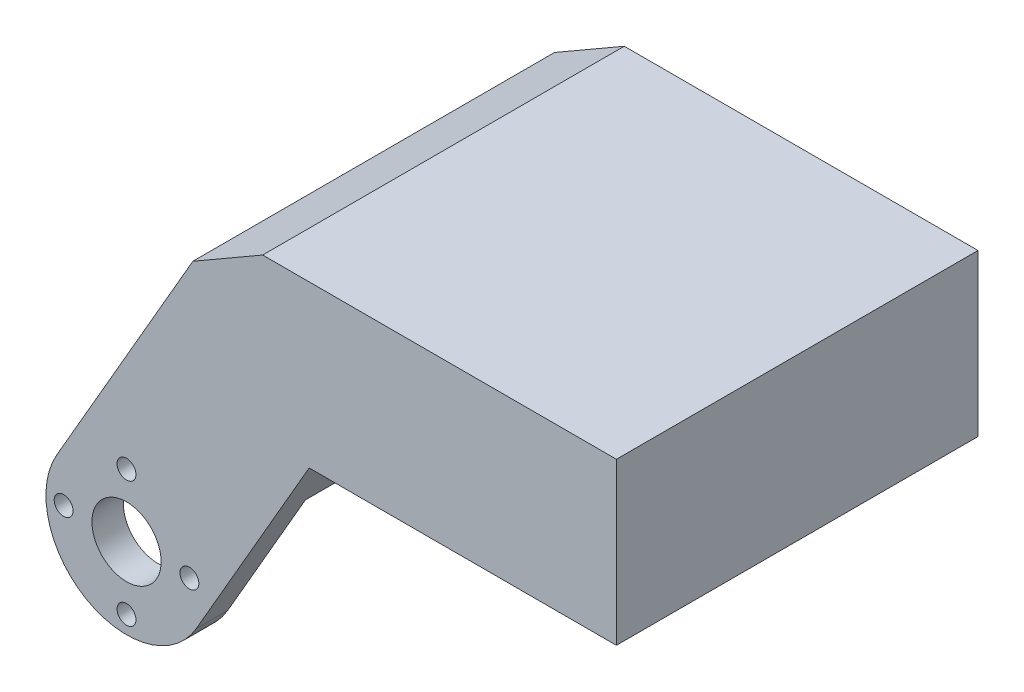
ISO-10303-21;
HEADER;
FILE_DESCRIPTION(('STEP AP214'),'2;1');
FILE_NAME('part.step','',(''),(''),'','','');
FILE_SCHEMA(('AUTOMOTIVE_DESIGN { 1 0 10303 214 1 1 1 1 }'));
ENDSEC;
DATA;
#1=APPLICATION_CONTEXT('core data for automotive mechanical design processes');
#2=APPLICATION_PROTOCOL_DEFINITION('international standard','automotive_design',2000,#1);
#3=PRODUCT_CONTEXT('',#1,'mechanical');
#4=PRODUCT('Part','Part','',(#3));
#5=PRODUCT_RELATED_PRODUCT_CATEGORY('part','',(#4));
#6=PRODUCT_DEFINITION_FORMATION('','',#4);
#7=PRODUCT_DEFINITION_CONTEXT('part definition',#1,'design');
#8=PRODUCT_DEFINITION('design','',#6,#7);
#9=PRODUCT_DEFINITION_SHAPE('','',#8);
#10=(LENGTH_UNIT() NAMED_UNIT(*) SI_UNIT(.MILLI.,.METRE.));
#11=(NAMED_UNIT(*) PLANE_ANGLE_UNIT() SI_UNIT($,.RADIAN.));
#12=(NAMED_UNIT(*) SI_UNIT($,.STERADIAN.) SOLID_ANGLE_UNIT());
#13=UNCERTAINTY_MEASURE_WITH_UNIT(LENGTH_MEASURE(1.E-05),#10,'distance_accuracy_value','');
#14=(GEOMETRIC_REPRESENTATION_CONTEXT(3) GLOBAL_UNCERTAINTY_ASSIGNED_CONTEXT((#13)) GLOBAL_UNIT_ASSIGNED_CONTEXT((#10,
#11,#12)) REPRESENTATION_CONTEXT('',''));
#15=CARTESIAN_POINT('',(0.,0.,0.));
#16=DIRECTION('',(0.,0.,1.));
#17=DIRECTION('',(1.,0.,0.));
#18=AXIS2_PLACEMENT_3D('',#15,#16,#17);
#19=CARTESIAN_POINT('',(0.,-8.,-46.));
#20=DIRECTION('',(0.,0.,1.));
#21=DIRECTION('',(1.,0.,0.));
#22=AXIS2_PLACEMENT_3D('',#19,#20,#21);
#23=CYLINDRICAL_SURFACE('',#22,1.2);
#24=CARTESIAN_POINT('',(0.,-8.,-4.));
#25=DIRECTION('',(0.,0.,1.));
#26=DIRECTION('',(0.,-1.,0.));
#27=AXIS2_PLACEMENT_3D('',#24,#25,#26);
#28=CIRCLE('',#27,1.2);
#29=CARTESIAN_POINT('',(0.,-9.2,-4.));
#30=VERTEX_POINT('',#29);
#31=EDGE_CURVE('E174',#30,#30,#28,.F.);
#32=ORIENTED_EDGE('',*,*,#31,.T.);
#33=EDGE_LOOP('',(#32));
#34=FACE_BOUND('',#33,.T.);
#35=CARTESIAN_POINT('',(0.,-8.,0.));
#36=DIRECTION('',(0.,0.,1.));
#37=DIRECTION('',(1.,0.,0.));
#38=AXIS2_PLACEMENT_3D('',#35,#36,#37);
#39=CIRCLE('',#38,1.2);
#40=CARTESIAN_POINT('',(1.19999999999994,-8.,0.));
#41=VERTEX_POINT('',#40);
#42=EDGE_CURVE('E206',#41,#41,#39,.T.);
#43=ORIENTED_EDGE('',*,*,#42,.T.);
#44=EDGE_LOOP('',(#43));
#45=FACE_BOUND('',#44,.T.);
#46=ADVANCED_FACE('F47',(#34,#45),#23,.F.);
#47=CARTESIAN_POINT('',(0.,0.,-46.));
#48=DIRECTION('',(0.,0.,1.));
#49=DIRECTION('',(1.,0.,0.));
#50=AXIS2_PLACEMENT_3D('',#47,#48,#49);
#51=CYLINDRICAL_SURFACE('',#50,10.25);
#52=CARTESIAN_POINT('',(0.,0.,-4.));
#53=DIRECTION('',(0.,0.,1.));
#54=DIRECTION('',(0.,-1.,0.));
#55=AXIS2_PLACEMENT_3D('',#52,#53,#54);
#56=CIRCLE('',#55,10.25);
#57=CARTESIAN_POINT('',(8.87676038879049,-5.12500000000001,-4.));
#58=VERTEX_POINT('',#57);
#59=CARTESIAN_POINT('',(-8.87676038879046,5.12499999999999,-4.));
#60=VERTEX_POINT('',#59);
#61=EDGE_CURVE('E266',#58,#60,#56,.F.);
#62=ORIENTED_EDGE('',*,*,#61,.F.);
#63=DIRECTION('',(0.,0.,1.));
#64=VECTOR('',#63,1.);
#65=CARTESIAN_POINT('',(8.87676038879048,-5.12500000000001,-46.));
#66=LINE('',#65,#64);
#67=CARTESIAN_POINT('',(8.87676038879048,-5.12500000000001,0.));
#68=VERTEX_POINT('',#67);
#69=EDGE_CURVE('E228',#58,#68,#66,.T.);
#70=ORIENTED_EDGE('',*,*,#69,.T.);
#71=CARTESIAN_POINT('',(0.,0.,0.));
#72=DIRECTION('',(0.,0.,1.));
#73=DIRECTION('',(1.,0.,0.));
#74=AXIS2_PLACEMENT_3D('',#71,#72,#73);
#75=CIRCLE('',#74,10.25);
#76=CARTESIAN_POINT('',(-8.87676038879048,5.125,0.));
#77=VERTEX_POINT('',#76);
#78=EDGE_CURVE('E186',#77,#68,#75,.T.);
#79=ORIENTED_EDGE('',*,*,#78,.F.);
#80=DIRECTION('',(0.,0.,1.));
#81=VECTOR('',#80,1.);
#82=CARTESIAN_POINT('',(-8.87676038879048,5.125,-46.));
#83=LINE('',#82,#81);
#84=EDGE_CURVE('E168',#60,#77,#83,.T.);
#85=ORIENTED_EDGE('',*,*,#84,.F.);
#86=EDGE_LOOP('',(#62,#70,#79,#85));
#87=FACE_BOUND('',#86,.T.);
#88=ADVANCED_FACE('F306',(#87),#51,.T.);
#89=CARTESIAN_POINT('',(8.,0.,-46.));
#90=DIRECTION('',(0.,0.,1.));
#91=DIRECTION('',(1.,0.,0.));
#92=AXIS2_PLACEMENT_3D('',#89,#90,#91);
#93=CYLINDRICAL_SURFACE('',#92,1.2);
#94=CARTESIAN_POINT('',(8.,0.,-4.));
#95=DIRECTION('',(0.,0.,1.));
#96=DIRECTION('',(0.,-1.,0.));
#97=AXIS2_PLACEMENT_3D('',#94,#95,#96);
#98=CIRCLE('',#97,1.2);
#99=CARTESIAN_POINT('',(8.,-1.20000000000003,-4.));
#100=VERTEX_POINT('',#99);
#101=EDGE_CURVE('E262',#100,#100,#98,.F.);
#102=ORIENTED_EDGE('',*,*,#101,.T.);
#103=EDGE_LOOP('',(#102));
#104=FACE_BOUND('',#103,.T.);
#105=CARTESIAN_POINT('',(8.,0.,0.));
#106=DIRECTION('',(0.,0.,1.));
#107=DIRECTION('',(1.,0.,0.));
#108=AXIS2_PLACEMENT_3D('',#105,#106,#107);
#109=CIRCLE('',#108,1.2);
#110=CARTESIAN_POINT('',(9.2,0.,0.));
#111=VERTEX_POINT('',#110);
#112=EDGE_CURVE('E178',#111,#111,#109,.T.);
#113=ORIENTED_EDGE('',*,*,#112,.T.);
#114=EDGE_LOOP('',(#113));
#115=FACE_BOUND('',#114,.T.);
#116=ADVANCED_FACE('F314',(#104,#115),#93,.F.);
#117=CARTESIAN_POINT('',(0.,8.,-46.));
#118=DIRECTION('',(0.,0.,1.));
#119=DIRECTION('',(1.,0.,0.));
#120=AXIS2_PLACEMENT_3D('',#117,#118,#119);
#121=CYLINDRICAL_SURFACE('',#120,1.2);
#122=CARTESIAN_POINT('',(0.,8.,-4.));
#123=DIRECTION('',(0.,0.,1.));
#124=DIRECTION('',(0.,-1.,0.));
#125=AXIS2_PLACEMENT_3D('',#122,#123,#124);
#126=CIRCLE('',#125,1.2);
#127=CARTESIAN_POINT('',(0.,6.8,-4.));
#128=VERTEX_POINT('',#127);
#129=EDGE_CURVE('E246',#128,#128,#126,.F.);
#130=ORIENTED_EDGE('',*,*,#129,.T.);
#131=EDGE_LOOP('',(#130));
#132=FACE_BOUND('',#131,.T.);
#133=CARTESIAN_POINT('',(0.,8.,0.));
#134=DIRECTION('',(0.,0.,1.));
#135=DIRECTION('',(1.,0.,0.));
#136=AXIS2_PLACEMENT_3D('',#133,#134,#135);
#137=CIRCLE('',#136,1.2);
#138=CARTESIAN_POINT('',(1.2,8.,0.));
#139=VERTEX_POINT('',#138);
#140=EDGE_CURVE('E173',#139,#139,#137,.T.);
#141=ORIENTED_EDGE('',*,*,#140,.T.);
#142=EDGE_LOOP('',(#141));
#143=FACE_BOUND('',#142,.T.);
#144=ADVANCED_FACE('F378',(#132,#143),#121,.F.);
#145=CARTESIAN_POINT('',(-8.,0.,-46.));
#146=DIRECTION('',(0.,0.,1.));
#147=DIRECTION('',(1.,0.,0.));
#148=AXIS2_PLACEMENT_3D('',#145,#146,#147);
#149=CYLINDRICAL_SURFACE('',#148,1.2);
#150=CARTESIAN_POINT('',(-8.,0.,-4.));
#151=DIRECTION('',(0.,0.,1.));
#152=DIRECTION('',(0.,-1.,0.));
#153=AXIS2_PLACEMENT_3D('',#150,#151,#152);
#154=CIRCLE('',#153,1.2);
#155=CARTESIAN_POINT('',(-8.,-1.19999999999992,-4.));
#156=VERTEX_POINT('',#155);
#157=EDGE_CURVE('E239',#156,#156,#154,.F.);
#158=ORIENTED_EDGE('',*,*,#157,.T.);
#159=EDGE_LOOP('',(#158));
#160=FACE_BOUND('',#159,.T.);
#161=CARTESIAN_POINT('',(-8.,0.,0.));
#162=DIRECTION('',(0.,0.,1.));
#163=DIRECTION('',(1.,0.,0.));
#164=AXIS2_PLACEMENT_3D('',#161,#162,#163);
#165=CIRCLE('',#164,1.2);
#166=CARTESIAN_POINT('',(-6.8,0.,0.));
#167=VERTEX_POINT('',#166);
#168=EDGE_CURVE('E169',#167,#167,#165,.T.);
#169=ORIENTED_EDGE('',*,*,#168,.T.);
#170=EDGE_LOOP('',(#169));
#171=FACE_BOUND('',#170,.T.);
#172=ADVANCED_FACE('F387',(#160,#171),#149,.F.);
#173=CARTESIAN_POINT('',(0.,0.,-46.));
#174=DIRECTION('',(0.,0.,1.));
#175=DIRECTION('',(1.,0.,0.));
#176=AXIS2_PLACEMENT_3D('',#173,#174,#175);
#177=CYLINDRICAL_SURFACE('',#176,4.4);
#178=CARTESIAN_POINT('',(0.,0.,-4.));
#179=DIRECTION('',(0.,0.,1.));
#180=DIRECTION('',(0.,-1.,0.));
#181=AXIS2_PLACEMENT_3D('',#178,#179,#180);
#182=CIRCLE('',#181,4.4);
#183=CARTESIAN_POINT('',(0.,-4.4,-4.));
#184=VERTEX_POINT('',#183);
#185=EDGE_CURVE('E236',#184,#184,#182,.F.);
#186=ORIENTED_EDGE('',*,*,#185,.T.);
#187=EDGE_LOOP('',(#186));
#188=FACE_BOUND('',#187,.T.);
#189=CARTESIAN_POINT('',(0.,0.,0.));
#190=DIRECTION('',(0.,0.,1.));
#191=DIRECTION('',(1.,0.,0.));
#192=AXIS2_PLACEMENT_3D('',#189,#190,#191);
#193=CIRCLE('',#192,4.4);
#194=CARTESIAN_POINT('',(4.4,0.,0.));
#195=VERTEX_POINT('',#194);
#196=EDGE_CURVE('E210',#195,#195,#193,.T.);
#197=ORIENTED_EDGE('',*,*,#196,.T.);
#198=EDGE_LOOP('',(#197));
#199=FACE_BOUND('',#198,.T.);
#200=ADVANCED_FACE('F396',(#188,#199),#177,.F.);
#201=CARTESIAN_POINT('',(-8.87676038879046,5.12499999999999,-46.));
#202=DIRECTION('',(-0.866025403784438,0.500000000000001,0.));
#203=DIRECTION('',(-0.500000000000001,-0.866025403784438,0.));
#204=AXIS2_PLACEMENT_3D('',#201,#202,#203);
#205=PLANE('',#204);
#206=DIRECTION('',(0.500000000000001,0.866025403784438,0.));
#207=VECTOR('',#206,1.);
#208=CARTESIAN_POINT('',(-14.0017603887905,-3.7517603887905,-4.));
#209=LINE('',#208,#207);
#210=CARTESIAN_POINT('',(0.998239611209551,22.2290017247426,-4.));
#211=VERTEX_POINT('',#210);
#212=EDGE_CURVE('E551',#60,#211,#209,.T.);
#213=ORIENTED_EDGE('',*,*,#212,.F.);
#214=ORIENTED_EDGE('',*,*,#84,.T.);
#215=DIRECTION('',(-0.500000000000001,-0.866025403784438,0.));
#216=VECTOR('',#215,1.);
#217=CARTESIAN_POINT('',(-8.87676038879046,5.12499999999999,0.));
#218=LINE('',#217,#216);
#219=CARTESIAN_POINT('',(8.44374768689834,35.125,0.));
#220=VERTEX_POINT('',#219);
#221=EDGE_CURVE('E182',#220,#77,#218,.T.);
#222=ORIENTED_EDGE('',*,*,#221,.F.);
#223=DIRECTION('',(0.,0.,1.));
#224=VECTOR('',#223,1.);
#225=CARTESIAN_POINT('',(8.44374768689834,35.125,-46.));
#226=LINE('',#225,#224);
#227=CARTESIAN_POINT('',(8.44374768689834,35.125,-46.));
#228=VERTEX_POINT('',#227);
#229=EDGE_CURVE('E56',#228,#220,#226,.T.);
#230=ORIENTED_EDGE('',*,*,#229,.F.);
#231=DIRECTION('',(-0.500000000000001,-0.866025403784438,0.));
#232=VECTOR('',#231,1.);
#233=CARTESIAN_POINT('',(-8.87676038879046,5.12499999999999,-46.));
#234=LINE('',#233,#232);
#235=CARTESIAN_POINT('',(-8.87676038879048,5.125,-46.));
#236=VERTEX_POINT('',#235);
#237=EDGE_CURVE('E288',#228,#236,#234,.T.);
#238=ORIENTED_EDGE('',*,*,#237,.T.);
#239=CARTESIAN_POINT('',(-8.87676038879048,5.125,-42.));
#240=VERTEX_POINT('',#239);
#241=EDGE_CURVE('E107',#236,#240,#83,.T.);
#242=ORIENTED_EDGE('',*,*,#241,.T.);
#243=DIRECTION('',(-0.500000000000001,-0.866025403784438,0.));
#244=VECTOR('',#243,1.);
#245=CARTESIAN_POINT('',(-14.0017603887905,-3.7517603887905,-42.));
#246=LINE('',#245,#244);
#247=CARTESIAN_POINT('',(0.99823961120955,22.2290017247426,-42.));
#248=VERTEX_POINT('',#247);
#249=EDGE_CURVE('E63',#248,#240,#246,.T.);
#250=ORIENTED_EDGE('',*,*,#249,.F.);
#251=DIRECTION('',(0.,0.,-1.));
#252=VECTOR('',#251,1.);
#253=CARTESIAN_POINT('',(0.998239611209551,22.2290017247426,-4.));
#254=LINE('',#253,#252);
#255=EDGE_CURVE('E543',#211,#248,#254,.T.);
#256=ORIENTED_EDGE('',*,*,#255,.F.);
#257=EDGE_LOOP('',(#213,#214,#222,#230,#238,#242,#250,#256));
#258=FACE_BOUND('',#257,.T.);
#259=ADVANCED_FACE('F333',(#258),#205,.T.);
#260=CARTESIAN_POINT('',(-13.0986342322396,22.6874999999999,-46.));
#261=DIRECTION('',(0.500000000000001,-0.866025403784438,0.));
#262=DIRECTION('',(0.866025403784438,0.500000000000001,0.));
#263=AXIS2_PLACEMENT_3D('',#260,#261,#262);
#264=PLANE('',#263);
#265=DIRECTION('',(0.866025403784438,0.500000000000001,0.));
#266=VECTOR('',#265,1.);
#267=CARTESIAN_POINT('',(-13.0986342322396,22.6874999999999,0.));
#268=LINE('',#267,#266);
#269=CARTESIAN_POINT('',(17.3205080756888,40.25,0.));
#270=VERTEX_POINT('',#269);
#271=EDGE_CURVE('E203',#220,#270,#268,.T.);
#272=ORIENTED_EDGE('',*,*,#271,.T.);
#273=DIRECTION('',(0.,0.,1.));
#274=VECTOR('',#273,1.);
#275=CARTESIAN_POINT('',(17.3205080756888,40.25,-46.));
#276=LINE('',#275,#274);
#277=CARTESIAN_POINT('',(17.3205080756888,40.25,-46.));
#278=VERTEX_POINT('',#277);
#279=EDGE_CURVE('E146',#278,#270,#276,.T.);
#280=ORIENTED_EDGE('',*,*,#279,.F.);
#281=DIRECTION('',(0.866025403784438,0.500000000000001,0.));
#282=VECTOR('',#281,1.);
#283=CARTESIAN_POINT('',(-13.0986342322396,22.6874999999999,-46.));
#284=LINE('',#283,#282);
#285=EDGE_CURVE('E132',#228,#278,#284,.T.);
#286=ORIENTED_EDGE('',*,*,#285,.F.);
#287=ORIENTED_EDGE('',*,*,#229,.T.);
#288=EDGE_LOOP('',(#272,#280,#286,#287));
#289=FACE_BOUND('',#288,.T.);
#290=ADVANCED_FACE('F330',(#289),#264,.F.);
#291=CARTESIAN_POINT('',(0.,40.25,-46.));
#292=DIRECTION('',(0.,-1.,0.));
#293=DIRECTION('',(1.,0.,0.));
#294=AXIS2_PLACEMENT_3D('',#291,#292,#293);
#295=PLANE('',#294);
#296=DIRECTION('',(1.,0.,0.));
#297=VECTOR('',#296,1.);
#298=CARTESIAN_POINT('',(0.,40.25,0.));
#299=LINE('',#298,#297);
#300=CARTESIAN_POINT('',(62.3205080756888,40.25,0.));
#301=VERTEX_POINT('',#300);
#302=EDGE_CURVE('E141',#270,#301,#299,.T.);
#303=ORIENTED_EDGE('',*,*,#302,.T.);
#304=DIRECTION('',(0.,0.,1.));
#305=VECTOR('',#304,1.);
#306=CARTESIAN_POINT('',(62.3205080756888,40.25,-46.));
#307=LINE('',#306,#305);
#308=CARTESIAN_POINT('',(62.3205080756888,40.25,-46.));
#309=VERTEX_POINT('',#308);
#310=EDGE_CURVE('E139',#309,#301,#307,.T.);
#311=ORIENTED_EDGE('',*,*,#310,.F.);
#312=DIRECTION('',(1.,0.,0.));
#313=VECTOR('',#312,1.);
#314=CARTESIAN_POINT('',(0.,40.25,-46.));
#315=LINE('',#314,#313);
#316=EDGE_CURVE('E123',#278,#309,#315,.T.);
#317=ORIENTED_EDGE('',*,*,#316,.F.);
#318=ORIENTED_EDGE('',*,*,#279,.T.);
#319=EDGE_LOOP('',(#303,#311,#317,#318));
#320=FACE_BOUND('',#319,.T.);
#321=ADVANCED_FACE('F140',(#320),#295,.F.);
#322=CARTESIAN_POINT('',(62.3205080756888,0.,-46.));
#323=DIRECTION('',(1.,0.,0.));
#324=DIRECTION('',(0.,0.,-1.));
#325=AXIS2_PLACEMENT_3D('',#322,#323,#324);
#326=PLANE('',#325);
#327=DIRECTION('',(0.,1.,0.));
#328=VECTOR('',#327,1.);
#329=CARTESIAN_POINT('',(62.3205080756888,0.,0.));
#330=LINE('',#329,#328);
#331=CARTESIAN_POINT('',(62.3205080756888,19.75,0.));
#332=VERTEX_POINT('',#331);
#333=EDGE_CURVE('E198',#332,#301,#330,.T.);
#334=ORIENTED_EDGE('',*,*,#333,.F.);
#335=DIRECTION('',(0.,0.,1.));
#336=VECTOR('',#335,1.);
#337=CARTESIAN_POINT('',(62.3205080756888,19.75,-46.));
#338=LINE('',#337,#336);
#339=CARTESIAN_POINT('',(62.3205080756888,19.75,-46.));
#340=VERTEX_POINT('',#339);
#341=EDGE_CURVE('E147',#340,#332,#338,.T.);
#342=ORIENTED_EDGE('',*,*,#341,.F.);
#343=DIRECTION('',(0.,1.,0.));
#344=VECTOR('',#343,1.);
#345=CARTESIAN_POINT('',(62.3205080756888,0.,-46.));
#346=LINE('',#345,#344);
#347=EDGE_CURVE('E130',#340,#309,#346,.T.);
#348=ORIENTED_EDGE('',*,*,#347,.T.);
#349=ORIENTED_EDGE('',*,*,#310,.T.);
#350=EDGE_LOOP('',(#334,#342,#348,#349));
#351=FACE_BOUND('',#350,.T.);
#352=ADVANCED_FACE('F149',(#351),#326,.T.);
#353=CARTESIAN_POINT('',(0.,19.75,-46.));
#354=DIRECTION('',(0.,-1.,0.));
#355=DIRECTION('',(1.,0.,0.));
#356=AXIS2_PLACEMENT_3D('',#353,#354,#355);
#357=PLANE('',#356);
#358=DIRECTION('',(1.,0.,0.));
#359=VECTOR('',#358,1.);
#360=CARTESIAN_POINT('',(0.,19.75,0.));
#361=LINE('',#360,#359);
#362=CARTESIAN_POINT('',(23.2383483348825,19.75,0.));
#363=VERTEX_POINT('',#362);
#364=EDGE_CURVE('E194',#363,#332,#361,.T.);
#365=ORIENTED_EDGE('',*,*,#364,.F.);
#366=DIRECTION('',(0.,0.,1.));
#367=VECTOR('',#366,1.);
#368=CARTESIAN_POINT('',(23.2383483348825,19.75,-46.));
#369=LINE('',#368,#367);
#370=CARTESIAN_POINT('',(23.2383483348825,19.75,-46.));
#371=VERTEX_POINT('',#370);
#372=EDGE_CURVE('E221',#371,#363,#369,.T.);
#373=ORIENTED_EDGE('',*,*,#372,.F.);
#374=DIRECTION('',(1.,0.,0.));
#375=VECTOR('',#374,1.);
#376=CARTESIAN_POINT('',(0.,19.75,-46.));
#377=LINE('',#376,#375);
#378=EDGE_CURVE('E151',#371,#340,#377,.T.);
#379=ORIENTED_EDGE('',*,*,#378,.T.);
#380=ORIENTED_EDGE('',*,*,#341,.T.);
#381=EDGE_LOOP('',(#365,#373,#379,#380));
#382=FACE_BOUND('',#381,.T.);
#383=ADVANCED_FACE('F338',(#382),#357,.T.);
#384=CARTESIAN_POINT('',(8.87676038879047,-5.125,-46.));
#385=DIRECTION('',(-0.866025403784438,0.500000000000001,0.));
#386=DIRECTION('',(-0.500000000000001,-0.866025403784438,0.));
#387=AXIS2_PLACEMENT_3D('',#384,#385,#386);
#388=PLANE('',#387);
#389=ORIENTED_EDGE('',*,*,#69,.F.);
#390=DIRECTION('',(0.500000000000001,0.866025403784438,0.));
#391=VECTOR('',#390,1.);
#392=CARTESIAN_POINT('',(8.87676038879047,-5.12500000000001,-4.));
#393=LINE('',#392,#391);
#394=CARTESIAN_POINT('',(18.7517603887905,11.9790017247426,-4.));
#395=VERTEX_POINT('',#394);
#396=EDGE_CURVE('E270',#58,#395,#393,.T.);
#397=ORIENTED_EDGE('',*,*,#396,.T.);
#398=DIRECTION('',(0.,0.,-1.));
#399=VECTOR('',#398,1.);
#400=CARTESIAN_POINT('',(18.7517603887905,11.9790017247426,-46.));
#401=LINE('',#400,#399);
#402=CARTESIAN_POINT('',(18.7517603887905,11.9790017247426,-42.));
#403=VERTEX_POINT('',#402);
#404=EDGE_CURVE('E11',#395,#403,#401,.T.);
#405=ORIENTED_EDGE('',*,*,#404,.T.);
#406=DIRECTION('',(-0.500000000000001,-0.866025403784438,0.));
#407=VECTOR('',#406,1.);
#408=CARTESIAN_POINT('',(8.87676038879047,-5.125,-42.));
#409=LINE('',#408,#407);
#410=CARTESIAN_POINT('',(8.87676038879049,-5.12500000000001,-42.));
#411=VERTEX_POINT('',#410);
#412=EDGE_CURVE('E249',#403,#411,#409,.T.);
#413=ORIENTED_EDGE('',*,*,#412,.T.);
#414=CARTESIAN_POINT('',(8.87676038879048,-5.12500000000001,-46.));
#415=VERTEX_POINT('',#414);
#416=EDGE_CURVE('E224',#415,#411,#66,.T.);
#417=ORIENTED_EDGE('',*,*,#416,.F.);
#418=DIRECTION('',(-0.500000000000001,-0.866025403784438,0.));
#419=VECTOR('',#418,1.);
#420=CARTESIAN_POINT('',(8.87676038879047,-5.125,-46.));
#421=LINE('',#420,#419);
#422=EDGE_CURVE('E154',#371,#415,#421,.T.);
#423=ORIENTED_EDGE('',*,*,#422,.F.);
#424=ORIENTED_EDGE('',*,*,#372,.T.);
#425=DIRECTION('',(-0.500000000000001,-0.866025403784438,0.));
#426=VECTOR('',#425,1.);
#427=CARTESIAN_POINT('',(8.87676038879047,-5.125,0.));
#428=LINE('',#427,#426);
#429=EDGE_CURVE('E190',#363,#68,#428,.T.);
#430=ORIENTED_EDGE('',*,*,#429,.T.);
#431=EDGE_LOOP('',(#389,#397,#405,#413,#417,#423,#424,#430));
#432=FACE_BOUND('',#431,.T.);
#433=ADVANCED_FACE('F298',(#432),#388,.F.);
#434=CARTESIAN_POINT('',(0.,-8.,-42.));
#435=DIRECTION('',(0.,0.,-1.));
#436=DIRECTION('',(-1.,0.,0.));
#437=AXIS2_PLACEMENT_3D('',#434,#435,#436);
#438=CIRCLE('',#437,1.2);
#439=CARTESIAN_POINT('',(-1.20000000000006,-8.,-42.));
#440=VERTEX_POINT('',#439);
#441=EDGE_CURVE('E240',#440,#440,#438,.F.);
#442=ORIENTED_EDGE('',*,*,#441,.T.);
#443=EDGE_LOOP('',(#442));
#444=FACE_BOUND('',#443,.T.);
#445=CARTESIAN_POINT('',(0.,-8.,-46.));
#446=DIRECTION('',(0.,0.,1.));
#447=DIRECTION('',(1.,0.,0.));
#448=AXIS2_PLACEMENT_3D('',#445,#446,#447);
#449=CIRCLE('',#448,1.2);
#450=CARTESIAN_POINT('',(1.19999999999994,-8.,-46.));
#451=VERTEX_POINT('',#450);
#452=EDGE_CURVE('E160',#451,#451,#449,.T.);
#453=ORIENTED_EDGE('',*,*,#452,.F.);
#454=EDGE_LOOP('',(#453));
#455=FACE_BOUND('',#454,.T.);
#456=ADVANCED_FACE('F304',(#444,#455),#23,.F.);
#457=ORIENTED_EDGE('',*,*,#416,.T.);
#458=CARTESIAN_POINT('',(0.,0.,-42.));
#459=DIRECTION('',(0.,0.,-1.));
#460=DIRECTION('',(-1.,0.,0.));
#461=AXIS2_PLACEMENT_3D('',#458,#459,#460);
#462=CIRCLE('',#461,10.25);
#463=EDGE_CURVE('E255',#240,#411,#462,.F.);
#464=ORIENTED_EDGE('',*,*,#463,.F.);
#465=ORIENTED_EDGE('',*,*,#241,.F.);
#466=CARTESIAN_POINT('',(0.,0.,-46.));
#467=DIRECTION('',(0.,0.,1.));
#468=DIRECTION('',(1.,0.,0.));
#469=AXIS2_PLACEMENT_3D('',#466,#467,#468);
#470=CIRCLE('',#469,10.25);
#471=EDGE_CURVE('E291',#236,#415,#470,.T.);
#472=ORIENTED_EDGE('',*,*,#471,.T.);
#473=EDGE_LOOP('',(#457,#464,#465,#472));
#474=FACE_BOUND('',#473,.T.);
#475=ADVANCED_FACE('F301',(#474),#51,.T.);
#476=CARTESIAN_POINT('',(8.,0.,-42.));
#477=DIRECTION('',(0.,0.,-1.));
#478=DIRECTION('',(-1.,0.,0.));
#479=AXIS2_PLACEMENT_3D('',#476,#477,#478);
#480=CIRCLE('',#479,1.2);
#481=CARTESIAN_POINT('',(6.8,0.,-42.));
#482=VERTEX_POINT('',#481);
#483=EDGE_CURVE('E519',#482,#482,#480,.F.);
#484=ORIENTED_EDGE('',*,*,#483,.T.);
#485=EDGE_LOOP('',(#484));
#486=FACE_BOUND('',#485,.T.);
#487=CARTESIAN_POINT('',(8.,0.,-46.));
#488=DIRECTION('',(0.,0.,1.));
#489=DIRECTION('',(1.,0.,0.));
#490=AXIS2_PLACEMENT_3D('',#487,#488,#489);
#491=CIRCLE('',#490,1.2);
#492=CARTESIAN_POINT('',(9.2,0.,-46.));
#493=VERTEX_POINT('',#492);
#494=EDGE_CURVE('E284',#493,#493,#491,.T.);
#495=ORIENTED_EDGE('',*,*,#494,.F.);
#496=EDGE_LOOP('',(#495));
#497=FACE_BOUND('',#496,.T.);
#498=ADVANCED_FACE('F303',(#486,#497),#93,.F.);
#499=CARTESIAN_POINT('',(0.,8.,-42.));
#500=DIRECTION('',(0.,0.,-1.));
#501=DIRECTION('',(-1.,0.,0.));
#502=AXIS2_PLACEMENT_3D('',#499,#500,#501);
#503=CIRCLE('',#502,1.2);
#504=CARTESIAN_POINT('',(-1.2,8.,-42.));
#505=VERTEX_POINT('',#504);
#506=EDGE_CURVE('E528',#505,#505,#503,.F.);
#507=ORIENTED_EDGE('',*,*,#506,.T.);
#508=EDGE_LOOP('',(#507));
#509=FACE_BOUND('',#508,.T.);
#510=CARTESIAN_POINT('',(0.,8.,-46.));
#511=DIRECTION('',(0.,0.,1.));
#512=DIRECTION('',(1.,0.,0.));
#513=AXIS2_PLACEMENT_3D('',#510,#511,#512);
#514=CIRCLE('',#513,1.2);
#515=CARTESIAN_POINT('',(1.2,8.,-46.));
#516=VERTEX_POINT('',#515);
#517=EDGE_CURVE('E280',#516,#516,#514,.T.);
#518=ORIENTED_EDGE('',*,*,#517,.F.);
#519=EDGE_LOOP('',(#518));
#520=FACE_BOUND('',#519,.T.);
#521=ADVANCED_FACE('F311',(#509,#520),#121,.F.);
#522=CARTESIAN_POINT('',(-8.,0.,-42.));
#523=DIRECTION('',(0.,0.,-1.));
#524=DIRECTION('',(-1.,0.,0.));
#525=AXIS2_PLACEMENT_3D('',#522,#523,#524);
#526=CIRCLE('',#525,1.2);
#527=CARTESIAN_POINT('',(-9.2,0.,-42.));
#528=VERTEX_POINT('',#527);
#529=EDGE_CURVE('E234',#528,#528,#526,.F.);
#530=ORIENTED_EDGE('',*,*,#529,.T.);
#531=EDGE_LOOP('',(#530));
#532=FACE_BOUND('',#531,.T.);
#533=CARTESIAN_POINT('',(-8.,0.,-46.));
#534=DIRECTION('',(0.,0.,1.));
#535=DIRECTION('',(1.,0.,0.));
#536=AXIS2_PLACEMENT_3D('',#533,#534,#535);
#537=CIRCLE('',#536,1.2);
#538=CARTESIAN_POINT('',(-6.8,0.,-46.));
#539=VERTEX_POINT('',#538);
#540=EDGE_CURVE('E214',#539,#539,#537,.T.);
#541=ORIENTED_EDGE('',*,*,#540,.F.);
#542=EDGE_LOOP('',(#541));
#543=FACE_BOUND('',#542,.T.);
#544=ADVANCED_FACE('F49',(#532,#543),#149,.F.);
#545=CARTESIAN_POINT('',(0.,0.,-42.));
#546=DIRECTION('',(0.,0.,-1.));
#547=DIRECTION('',(-1.,0.,0.));
#548=AXIS2_PLACEMENT_3D('',#545,#546,#547);
#549=CIRCLE('',#548,4.4);
#550=CARTESIAN_POINT('',(-4.4,0.,-42.));
#551=VERTEX_POINT('',#550);
#552=EDGE_CURVE('E231',#551,#551,#549,.F.);
#553=ORIENTED_EDGE('',*,*,#552,.T.);
#554=EDGE_LOOP('',(#553));
#555=FACE_BOUND('',#554,.T.);
#556=CARTESIAN_POINT('',(0.,0.,-46.));
#557=DIRECTION('',(0.,0.,1.));
#558=DIRECTION('',(1.,0.,0.));
#559=AXIS2_PLACEMENT_3D('',#556,#557,#558);
#560=CIRCLE('',#559,4.4);
#561=CARTESIAN_POINT('',(4.4,0.,-46.));
#562=VERTEX_POINT('',#561);
#563=EDGE_CURVE('E164',#562,#562,#560,.T.);
#564=ORIENTED_EDGE('',*,*,#563,.F.);
#565=EDGE_LOOP('',(#564));
#566=FACE_BOUND('',#565,.T.);
#567=ADVANCED_FACE('F328',(#555,#566),#177,.F.);
#568=CARTESIAN_POINT('',(0.,0.,-46.));
#569=DIRECTION('',(0.,0.,1.));
#570=DIRECTION('',(1.,0.,0.));
#571=AXIS2_PLACEMENT_3D('',#568,#569,#570);
#572=PLANE('',#571);
#573=ORIENTED_EDGE('',*,*,#540,.T.);
#574=EDGE_LOOP('',(#573));
#575=FACE_BOUND('',#574,.T.);
#576=ORIENTED_EDGE('',*,*,#517,.T.);
#577=EDGE_LOOP('',(#576));
#578=FACE_BOUND('',#577,.T.);
#579=ORIENTED_EDGE('',*,*,#494,.T.);
#580=EDGE_LOOP('',(#579));
#581=FACE_BOUND('',#580,.T.);
#582=ORIENTED_EDGE('',*,*,#237,.F.);
#583=ORIENTED_EDGE('',*,*,#285,.T.);
#584=ORIENTED_EDGE('',*,*,#316,.T.);
#585=ORIENTED_EDGE('',*,*,#347,.F.);
#586=ORIENTED_EDGE('',*,*,#378,.F.);
#587=ORIENTED_EDGE('',*,*,#422,.T.);
#588=ORIENTED_EDGE('',*,*,#471,.F.);
#589=EDGE_LOOP('',(#582,#583,#584,#585,#586,#587,#588));
#590=FACE_BOUND('',#589,.T.);
#591=ORIENTED_EDGE('',*,*,#452,.T.);
#592=EDGE_LOOP('',(#591));
#593=FACE_BOUND('',#592,.T.);
#594=ORIENTED_EDGE('',*,*,#563,.T.);
#595=EDGE_LOOP('',(#594));
#596=FACE_BOUND('',#595,.T.);
#597=ADVANCED_FACE('F126',(#575,#578,#581,#590,#593,#596),#572,.F.);
#598=CARTESIAN_POINT('',(0.,0.,0.));
#599=DIRECTION('',(0.,0.,1.));
#600=DIRECTION('',(1.,0.,0.));
#601=AXIS2_PLACEMENT_3D('',#598,#599,#600);
#602=PLANE('',#601);
#603=ORIENTED_EDGE('',*,*,#168,.F.);
#604=EDGE_LOOP('',(#603));
#605=FACE_BOUND('',#604,.T.);
#606=ORIENTED_EDGE('',*,*,#140,.F.);
#607=EDGE_LOOP('',(#606));
#608=FACE_BOUND('',#607,.T.);
#609=ORIENTED_EDGE('',*,*,#112,.F.);
#610=EDGE_LOOP('',(#609));
#611=FACE_BOUND('',#610,.T.);
#612=ORIENTED_EDGE('',*,*,#221,.T.);
#613=ORIENTED_EDGE('',*,*,#78,.T.);
#614=ORIENTED_EDGE('',*,*,#429,.F.);
#615=ORIENTED_EDGE('',*,*,#364,.T.);
#616=ORIENTED_EDGE('',*,*,#333,.T.);
#617=ORIENTED_EDGE('',*,*,#302,.F.);
#618=ORIENTED_EDGE('',*,*,#271,.F.);
#619=EDGE_LOOP('',(#612,#613,#614,#615,#616,#617,#618));
#620=FACE_BOUND('',#619,.T.);
#621=ORIENTED_EDGE('',*,*,#42,.F.);
#622=EDGE_LOOP('',(#621));
#623=FACE_BOUND('',#622,.T.);
#624=ORIENTED_EDGE('',*,*,#196,.F.);
#625=EDGE_LOOP('',(#624));
#626=FACE_BOUND('',#625,.T.);
#627=ADVANCED_FACE('F405',(#605,#608,#611,#620,#623,#626),#602,.T.);
#628=CARTESIAN_POINT('',(40.8354081852937,-0.770998275257395,-4.));
#629=DIRECTION('',(0.500000000000001,0.866025403784438,0.));
#630=DIRECTION('',(-0.866025403784438,0.500000000000001,0.));
#631=AXIS2_PLACEMENT_3D('',#628,#629,#630);
#632=PLANE('',#631);
#633=DIRECTION('',(-0.866025403784438,0.500000000000001,0.));
#634=VECTOR('',#633,1.);
#635=CARTESIAN_POINT('',(40.8354081852937,-0.770998275257395,-4.));
#636=LINE('',#635,#634);
#637=EDGE_CURVE('E546',#395,#211,#636,.T.);
#638=ORIENTED_EDGE('',*,*,#637,.T.);
#639=ORIENTED_EDGE('',*,*,#255,.T.);
#640=DIRECTION('',(-0.866025403784438,0.500000000000001,0.));
#641=VECTOR('',#640,1.);
#642=CARTESIAN_POINT('',(40.8354081852937,-0.770998275257399,-42.));
#643=LINE('',#642,#641);
#644=EDGE_CURVE('E235',#403,#248,#643,.T.);
#645=ORIENTED_EDGE('',*,*,#644,.F.);
#646=ORIENTED_EDGE('',*,*,#404,.F.);
#647=EDGE_LOOP('',(#638,#639,#645,#646));
#648=FACE_BOUND('',#647,.T.);
#649=ADVANCED_FACE('F429',(#648),#632,.F.);
#650=CARTESIAN_POINT('',(25.8354081852937,-26.7517603887905,-4.));
#651=DIRECTION('',(0.,0.,1.));
#652=DIRECTION('',(0.,-1.,0.));
#653=AXIS2_PLACEMENT_3D('',#650,#651,#652);
#654=PLANE('',#653);
#655=ORIENTED_EDGE('',*,*,#396,.F.);
#656=ORIENTED_EDGE('',*,*,#61,.T.);
#657=ORIENTED_EDGE('',*,*,#212,.T.);
#658=ORIENTED_EDGE('',*,*,#637,.F.);
#659=EDGE_LOOP('',(#655,#656,#657,#658));
#660=FACE_BOUND('',#659,.T.);
#661=ORIENTED_EDGE('',*,*,#101,.F.);
#662=EDGE_LOOP('',(#661));
#663=FACE_BOUND('',#662,.T.);
#664=ORIENTED_EDGE('',*,*,#157,.F.);
#665=EDGE_LOOP('',(#664));
#666=FACE_BOUND('',#665,.T.);
#667=ORIENTED_EDGE('',*,*,#185,.F.);
#668=EDGE_LOOP('',(#667));
#669=FACE_BOUND('',#668,.T.);
#670=ORIENTED_EDGE('',*,*,#129,.F.);
#671=EDGE_LOOP('',(#670));
#672=FACE_BOUND('',#671,.T.);
#673=ORIENTED_EDGE('',*,*,#31,.F.);
#674=EDGE_LOOP('',(#673));
#675=FACE_BOUND('',#674,.T.);
#676=ADVANCED_FACE('F490',(#660,#663,#666,#669,#672,#675),#654,.F.);
#677=CARTESIAN_POINT('',(25.8354081852937,-26.7517603887905,-42.));
#678=DIRECTION('',(0.,0.,-1.));
#679=DIRECTION('',(-1.,0.,0.));
#680=AXIS2_PLACEMENT_3D('',#677,#678,#679);
#681=PLANE('',#680);
#682=ORIENTED_EDGE('',*,*,#644,.T.);
#683=ORIENTED_EDGE('',*,*,#249,.T.);
#684=ORIENTED_EDGE('',*,*,#463,.T.);
#685=ORIENTED_EDGE('',*,*,#412,.F.);
#686=EDGE_LOOP('',(#682,#683,#684,#685));
#687=FACE_BOUND('',#686,.T.);
#688=ORIENTED_EDGE('',*,*,#483,.F.);
#689=EDGE_LOOP('',(#688));
#690=FACE_BOUND('',#689,.T.);
#691=ORIENTED_EDGE('',*,*,#529,.F.);
#692=EDGE_LOOP('',(#691));
#693=FACE_BOUND('',#692,.T.);
#694=ORIENTED_EDGE('',*,*,#552,.F.);
#695=EDGE_LOOP('',(#694));
#696=FACE_BOUND('',#695,.T.);
#697=ORIENTED_EDGE('',*,*,#506,.F.);
#698=EDGE_LOOP('',(#697));
#699=FACE_BOUND('',#698,.T.);
#700=ORIENTED_EDGE('',*,*,#441,.F.);
#701=EDGE_LOOP('',(#700));
#702=FACE_BOUND('',#701,.T.);
#703=ADVANCED_FACE('F500',(#687,#690,#693,#696,#699,#702),#681,.F.);
#704=CLOSED_SHELL('',(#46,#88,#116,#144,#172,#200,#259,#290,#321,#352,#383,#433,#456,#475,#498,
#521,#544,#567,#597,#627,#649,#676,#703));
#705=MANIFOLD_SOLID_BREP('B2',#704);
#706=ADVANCED_BREP_SHAPE_REPRESENTATION('',(#18,#705),#14);
#707=SHAPE_DEFINITION_REPRESENTATION(#9,#706);
ENDSEC;
END-ISO-10303-21;
